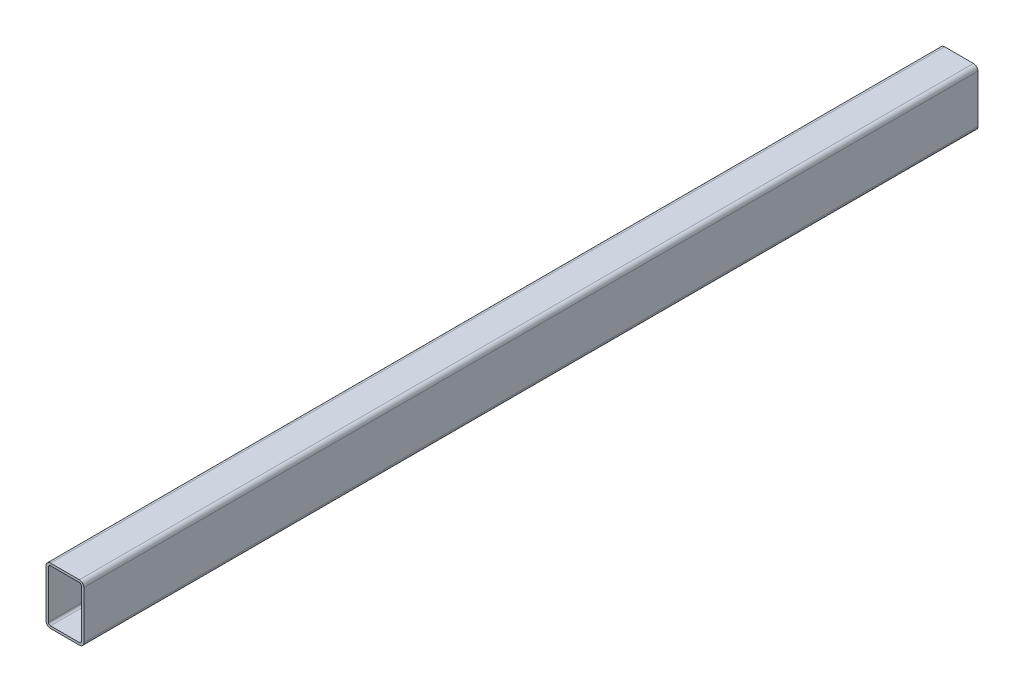
ISO-10303-21;
HEADER;
FILE_DESCRIPTION(('STEP AP214'),'2;1');
FILE_NAME('part.step','',(''),(''),'','','');
FILE_SCHEMA(('AUTOMOTIVE_DESIGN { 1 0 10303 214 1 1 1 1 }'));
ENDSEC;
DATA;
#1=APPLICATION_CONTEXT('core data for automotive mechanical design processes');
#2=APPLICATION_PROTOCOL_DEFINITION('international standard','automotive_design',2000,#1);
#3=PRODUCT_CONTEXT('',#1,'mechanical');
#4=PRODUCT('Part','Part','',(#3));
#5=PRODUCT_RELATED_PRODUCT_CATEGORY('part','',(#4));
#6=PRODUCT_DEFINITION_FORMATION('','',#4);
#7=PRODUCT_DEFINITION_CONTEXT('part definition',#1,'design');
#8=PRODUCT_DEFINITION('design','',#6,#7);
#9=PRODUCT_DEFINITION_SHAPE('','',#8);
#10=(LENGTH_UNIT() NAMED_UNIT(*) SI_UNIT(.MILLI.,.METRE.));
#11=(NAMED_UNIT(*) PLANE_ANGLE_UNIT() SI_UNIT($,.RADIAN.));
#12=(NAMED_UNIT(*) SI_UNIT($,.STERADIAN.) SOLID_ANGLE_UNIT());
#13=UNCERTAINTY_MEASURE_WITH_UNIT(LENGTH_MEASURE(1.E-05),#10,'distance_accuracy_value','');
#14=(GEOMETRIC_REPRESENTATION_CONTEXT(3) GLOBAL_UNCERTAINTY_ASSIGNED_CONTEXT((#13)) GLOBAL_UNIT_ASSIGNED_CONTEXT((#10,
#11,#12)) REPRESENTATION_CONTEXT('',''));
#15=CARTESIAN_POINT('',(0.,0.,0.));
#16=DIRECTION('',(0.,0.,1.));
#17=DIRECTION('',(1.,0.,0.));
#18=AXIS2_PLACEMENT_3D('',#15,#16,#17);
#19=CARTESIAN_POINT('',(-19.4,-32.1,600.8));
#20=DIRECTION('',(0.,0.,-1.));
#21=DIRECTION('',(-1.,0.,0.));
#22=AXIS2_PLACEMENT_3D('',#19,#20,#21);
#23=PLANE('',#22);
#24=CARTESIAN_POINT('',(-19.4,-32.1,600.8));
#25=DIRECTION('',(0.,0.,1.));
#26=DIRECTION('',(-1.,0.,0.));
#27=AXIS2_PLACEMENT_3D('',#24,#25,#26);
#28=CIRCLE('',#27,5.99999999999999);
#29=CARTESIAN_POINT('',(-25.4,-32.1,600.8));
#30=VERTEX_POINT('',#29);
#31=CARTESIAN_POINT('',(-19.4,-38.1,600.8));
#32=VERTEX_POINT('',#31);
#33=EDGE_CURVE('E215',#30,#32,#28,.T.);
#34=ORIENTED_EDGE('',*,*,#33,.T.);
#35=DIRECTION('',(1.,0.,0.));
#36=VECTOR('',#35,1.);
#37=CARTESIAN_POINT('',(19.4,-38.1,600.8));
#38=LINE('',#37,#36);
#39=CARTESIAN_POINT('',(19.4,-38.1,600.8));
#40=VERTEX_POINT('',#39);
#41=EDGE_CURVE('E218',#32,#40,#38,.T.);
#42=ORIENTED_EDGE('',*,*,#41,.T.);
#43=CARTESIAN_POINT('',(19.4,-32.1,600.8));
#44=DIRECTION('',(0.,0.,1.));
#45=DIRECTION('',(1.,0.,0.));
#46=AXIS2_PLACEMENT_3D('',#43,#44,#45);
#47=CIRCLE('',#46,6.);
#48=CARTESIAN_POINT('',(25.4,-32.1,600.8));
#49=VERTEX_POINT('',#48);
#50=EDGE_CURVE('E221',#40,#49,#47,.T.);
#51=ORIENTED_EDGE('',*,*,#50,.T.);
#52=DIRECTION('',(0.,1.,0.));
#53=VECTOR('',#52,1.);
#54=CARTESIAN_POINT('',(25.4,-32.1,600.8));
#55=LINE('',#54,#53);
#56=CARTESIAN_POINT('',(25.4,32.1,600.8));
#57=VERTEX_POINT('',#56);
#58=EDGE_CURVE('E223',#49,#57,#55,.T.);
#59=ORIENTED_EDGE('',*,*,#58,.T.);
#60=CARTESIAN_POINT('',(19.4,32.1,600.8));
#61=DIRECTION('',(0.,0.,1.));
#62=DIRECTION('',(1.,0.,0.));
#63=AXIS2_PLACEMENT_3D('',#60,#61,#62);
#64=CIRCLE('',#63,6.);
#65=CARTESIAN_POINT('',(19.4,38.1,600.8));
#66=VERTEX_POINT('',#65);
#67=EDGE_CURVE('E225',#57,#66,#64,.T.);
#68=ORIENTED_EDGE('',*,*,#67,.T.);
#69=DIRECTION('',(-1.,0.,0.));
#70=VECTOR('',#69,1.);
#71=CARTESIAN_POINT('',(19.4,38.1,600.8));
#72=LINE('',#71,#70);
#73=CARTESIAN_POINT('',(-19.4,38.1,600.8));
#74=VERTEX_POINT('',#73);
#75=EDGE_CURVE('E227',#66,#74,#72,.T.);
#76=ORIENTED_EDGE('',*,*,#75,.T.);
#77=CARTESIAN_POINT('',(-19.4,32.1,600.8));
#78=DIRECTION('',(0.,0.,1.));
#79=DIRECTION('',(1.,0.,0.));
#80=AXIS2_PLACEMENT_3D('',#77,#78,#79);
#81=CIRCLE('',#80,6.);
#82=CARTESIAN_POINT('',(-25.4,32.1,600.8));
#83=VERTEX_POINT('',#82);
#84=EDGE_CURVE('E229',#74,#83,#81,.T.);
#85=ORIENTED_EDGE('',*,*,#84,.T.);
#86=DIRECTION('',(0.,-1.,0.));
#87=VECTOR('',#86,1.);
#88=CARTESIAN_POINT('',(-25.4,-32.1,600.8));
#89=LINE('',#88,#87);
#90=EDGE_CURVE('E231',#83,#30,#89,.T.);
#91=ORIENTED_EDGE('',*,*,#90,.T.);
#92=EDGE_LOOP('',(#34,#42,#51,#59,#68,#76,#85,#91));
#93=FACE_BOUND('',#92,.T.);
#94=CARTESIAN_POINT('',(19.4,32.1,600.8));
#95=DIRECTION('',(0.,0.,1.));
#96=DIRECTION('',(1.,0.,0.));
#97=AXIS2_PLACEMENT_3D('',#94,#95,#96);
#98=CIRCLE('',#97,2.825);
#99=CARTESIAN_POINT('',(22.225,32.1,600.8));
#100=VERTEX_POINT('',#99);
#101=CARTESIAN_POINT('',(19.4,34.925,600.8));
#102=VERTEX_POINT('',#101);
#103=EDGE_CURVE('E150',#100,#102,#98,.T.);
#104=ORIENTED_EDGE('',*,*,#103,.F.);
#105=DIRECTION('',(0.,1.,0.));
#106=VECTOR('',#105,1.);
#107=CARTESIAN_POINT('',(22.225,-32.1,600.8));
#108=LINE('',#107,#106);
#109=CARTESIAN_POINT('',(22.225,-32.1,600.8));
#110=VERTEX_POINT('',#109);
#111=EDGE_CURVE('E183',#110,#100,#108,.T.);
#112=ORIENTED_EDGE('',*,*,#111,.F.);
#113=CARTESIAN_POINT('',(19.4,-32.1,600.8));
#114=DIRECTION('',(0.,0.,1.));
#115=DIRECTION('',(1.,0.,0.));
#116=AXIS2_PLACEMENT_3D('',#113,#114,#115);
#117=CIRCLE('',#116,2.825);
#118=CARTESIAN_POINT('',(19.4,-34.925,600.8));
#119=VERTEX_POINT('',#118);
#120=EDGE_CURVE('E181',#119,#110,#117,.T.);
#121=ORIENTED_EDGE('',*,*,#120,.F.);
#122=DIRECTION('',(1.,0.,0.));
#123=VECTOR('',#122,1.);
#124=CARTESIAN_POINT('',(19.4,-34.925,600.8));
#125=LINE('',#124,#123);
#126=CARTESIAN_POINT('',(-19.4,-34.925,600.8));
#127=VERTEX_POINT('',#126);
#128=EDGE_CURVE('E179',#127,#119,#125,.T.);
#129=ORIENTED_EDGE('',*,*,#128,.F.);
#130=CARTESIAN_POINT('',(-19.4,-32.1,600.8));
#131=DIRECTION('',(0.,0.,1.));
#132=DIRECTION('',(-1.,0.,0.));
#133=AXIS2_PLACEMENT_3D('',#130,#131,#132);
#134=CIRCLE('',#133,2.825);
#135=CARTESIAN_POINT('',(-22.225,-32.1,600.8));
#136=VERTEX_POINT('',#135);
#137=EDGE_CURVE('E177',#136,#127,#134,.T.);
#138=ORIENTED_EDGE('',*,*,#137,.F.);
#139=DIRECTION('',(0.,-1.,0.));
#140=VECTOR('',#139,1.);
#141=CARTESIAN_POINT('',(-22.225,-32.1,600.8));
#142=LINE('',#141,#140);
#143=CARTESIAN_POINT('',(-22.225,32.1,600.8));
#144=VERTEX_POINT('',#143);
#145=EDGE_CURVE('E173',#144,#136,#142,.T.);
#146=ORIENTED_EDGE('',*,*,#145,.F.);
#147=CARTESIAN_POINT('',(-19.4,32.1,600.8));
#148=DIRECTION('',(0.,0.,1.));
#149=DIRECTION('',(1.,0.,0.));
#150=AXIS2_PLACEMENT_3D('',#147,#148,#149);
#151=CIRCLE('',#150,2.825);
#152=CARTESIAN_POINT('',(-19.4,34.925,600.8));
#153=VERTEX_POINT('',#152);
#154=EDGE_CURVE('E171',#153,#144,#151,.T.);
#155=ORIENTED_EDGE('',*,*,#154,.F.);
#156=DIRECTION('',(-1.,0.,0.));
#157=VECTOR('',#156,1.);
#158=CARTESIAN_POINT('',(19.4,34.925,600.8));
#159=LINE('',#158,#157);
#160=EDGE_CURVE('E158',#102,#153,#159,.T.);
#161=ORIENTED_EDGE('',*,*,#160,.F.);
#162=EDGE_LOOP('',(#104,#112,#121,#129,#138,#146,#155,#161));
#163=FACE_BOUND('',#162,.T.);
#164=ADVANCED_FACE('F37',(#93,#163),#23,.F.);
#165=CARTESIAN_POINT('',(-19.4,-32.1,-600.8));
#166=DIRECTION('',(0.,0.,-1.));
#167=DIRECTION('',(-1.,0.,0.));
#168=AXIS2_PLACEMENT_3D('',#165,#166,#167);
#169=PLANE('',#168);
#170=CARTESIAN_POINT('',(-19.4,-32.1,-600.8));
#171=DIRECTION('',(0.,0.,1.));
#172=DIRECTION('',(-1.,0.,0.));
#173=AXIS2_PLACEMENT_3D('',#170,#171,#172);
#174=CIRCLE('',#173,5.99999999999999);
#175=CARTESIAN_POINT('',(-25.4,-32.1,-600.8));
#176=VERTEX_POINT('',#175);
#177=CARTESIAN_POINT('',(-19.4,-38.1,-600.8));
#178=VERTEX_POINT('',#177);
#179=EDGE_CURVE('E166',#176,#178,#174,.T.);
#180=ORIENTED_EDGE('',*,*,#179,.F.);
#181=DIRECTION('',(0.,-1.,0.));
#182=VECTOR('',#181,1.);
#183=CARTESIAN_POINT('',(-25.4,-32.1,-600.8));
#184=LINE('',#183,#182);
#185=CARTESIAN_POINT('',(-25.4,32.1,-600.8));
#186=VERTEX_POINT('',#185);
#187=EDGE_CURVE('E219',#186,#176,#184,.T.);
#188=ORIENTED_EDGE('',*,*,#187,.F.);
#189=CARTESIAN_POINT('',(-19.4,32.1,-600.8));
#190=DIRECTION('',(0.,0.,1.));
#191=DIRECTION('',(1.,0.,0.));
#192=AXIS2_PLACEMENT_3D('',#189,#190,#191);
#193=CIRCLE('',#192,6.);
#194=CARTESIAN_POINT('',(-19.4,38.1,-600.8));
#195=VERTEX_POINT('',#194);
#196=EDGE_CURVE('E246',#195,#186,#193,.T.);
#197=ORIENTED_EDGE('',*,*,#196,.F.);
#198=DIRECTION('',(-1.,0.,0.));
#199=VECTOR('',#198,1.);
#200=CARTESIAN_POINT('',(19.4,38.1,-600.8));
#201=LINE('',#200,#199);
#202=CARTESIAN_POINT('',(19.4,38.1,-600.8));
#203=VERTEX_POINT('',#202);
#204=EDGE_CURVE('E244',#203,#195,#201,.T.);
#205=ORIENTED_EDGE('',*,*,#204,.F.);
#206=CARTESIAN_POINT('',(19.4,32.1,-600.8));
#207=DIRECTION('',(0.,0.,1.));
#208=DIRECTION('',(1.,0.,0.));
#209=AXIS2_PLACEMENT_3D('',#206,#207,#208);
#210=CIRCLE('',#209,6.);
#211=CARTESIAN_POINT('',(25.4,32.1,-600.8));
#212=VERTEX_POINT('',#211);
#213=EDGE_CURVE('E242',#212,#203,#210,.T.);
#214=ORIENTED_EDGE('',*,*,#213,.F.);
#215=DIRECTION('',(0.,1.,0.));
#216=VECTOR('',#215,1.);
#217=CARTESIAN_POINT('',(25.4,-32.1,-600.8));
#218=LINE('',#217,#216);
#219=CARTESIAN_POINT('',(25.4,-32.1,-600.8));
#220=VERTEX_POINT('',#219);
#221=EDGE_CURVE('E240',#220,#212,#218,.T.);
#222=ORIENTED_EDGE('',*,*,#221,.F.);
#223=CARTESIAN_POINT('',(19.4,-32.1,-600.8));
#224=DIRECTION('',(0.,0.,1.));
#225=DIRECTION('',(1.,0.,0.));
#226=AXIS2_PLACEMENT_3D('',#223,#224,#225);
#227=CIRCLE('',#226,6.);
#228=CARTESIAN_POINT('',(19.4,-38.1,-600.8));
#229=VERTEX_POINT('',#228);
#230=EDGE_CURVE('E238',#229,#220,#227,.T.);
#231=ORIENTED_EDGE('',*,*,#230,.F.);
#232=DIRECTION('',(1.,0.,0.));
#233=VECTOR('',#232,1.);
#234=CARTESIAN_POINT('',(19.4,-38.1,-600.8));
#235=LINE('',#234,#233);
#236=EDGE_CURVE('E236',#178,#229,#235,.T.);
#237=ORIENTED_EDGE('',*,*,#236,.F.);
#238=EDGE_LOOP('',(#180,#188,#197,#205,#214,#222,#231,#237));
#239=FACE_BOUND('',#238,.T.);
#240=DIRECTION('',(0.,1.,0.));
#241=VECTOR('',#240,1.);
#242=CARTESIAN_POINT('',(22.225,-32.1,-600.8));
#243=LINE('',#242,#241);
#244=CARTESIAN_POINT('',(22.225,-32.1,-600.8));
#245=VERTEX_POINT('',#244);
#246=CARTESIAN_POINT('',(22.225,32.1,-600.8));
#247=VERTEX_POINT('',#246);
#248=EDGE_CURVE('E159',#245,#247,#243,.T.);
#249=ORIENTED_EDGE('',*,*,#248,.T.);
#250=CARTESIAN_POINT('',(19.4,32.1,-600.8));
#251=DIRECTION('',(0.,0.,1.));
#252=DIRECTION('',(1.,0.,0.));
#253=AXIS2_PLACEMENT_3D('',#250,#251,#252);
#254=CIRCLE('',#253,2.825);
#255=CARTESIAN_POINT('',(19.4,34.925,-600.8));
#256=VERTEX_POINT('',#255);
#257=EDGE_CURVE('E60',#247,#256,#254,.T.);
#258=ORIENTED_EDGE('',*,*,#257,.T.);
#259=DIRECTION('',(-1.,0.,0.));
#260=VECTOR('',#259,1.);
#261=CARTESIAN_POINT('',(19.4,34.925,-600.8));
#262=LINE('',#261,#260);
#263=CARTESIAN_POINT('',(-19.4,34.925,-600.8));
#264=VERTEX_POINT('',#263);
#265=EDGE_CURVE('E165',#256,#264,#262,.T.);
#266=ORIENTED_EDGE('',*,*,#265,.T.);
#267=CARTESIAN_POINT('',(-19.4,32.1,-600.8));
#268=DIRECTION('',(0.,0.,1.));
#269=DIRECTION('',(1.,0.,0.));
#270=AXIS2_PLACEMENT_3D('',#267,#268,#269);
#271=CIRCLE('',#270,2.825);
#272=CARTESIAN_POINT('',(-22.225,32.1,-600.8));
#273=VERTEX_POINT('',#272);
#274=EDGE_CURVE('E187',#264,#273,#271,.T.);
#275=ORIENTED_EDGE('',*,*,#274,.T.);
#276=DIRECTION('',(0.,-1.,0.));
#277=VECTOR('',#276,1.);
#278=CARTESIAN_POINT('',(-22.225,-32.1,-600.8));
#279=LINE('',#278,#277);
#280=CARTESIAN_POINT('',(-22.225,-32.1,-600.8));
#281=VERTEX_POINT('',#280);
#282=EDGE_CURVE('E190',#273,#281,#279,.T.);
#283=ORIENTED_EDGE('',*,*,#282,.T.);
#284=CARTESIAN_POINT('',(-19.4,-32.1,-600.8));
#285=DIRECTION('',(0.,0.,1.));
#286=DIRECTION('',(-1.,0.,0.));
#287=AXIS2_PLACEMENT_3D('',#284,#285,#286);
#288=CIRCLE('',#287,2.825);
#289=CARTESIAN_POINT('',(-19.4,-34.925,-600.8));
#290=VERTEX_POINT('',#289);
#291=EDGE_CURVE('E193',#281,#290,#288,.T.);
#292=ORIENTED_EDGE('',*,*,#291,.T.);
#293=DIRECTION('',(1.,0.,0.));
#294=VECTOR('',#293,1.);
#295=CARTESIAN_POINT('',(19.4,-34.925,-600.8));
#296=LINE('',#295,#294);
#297=CARTESIAN_POINT('',(19.4,-34.925,-600.8));
#298=VERTEX_POINT('',#297);
#299=EDGE_CURVE('E196',#290,#298,#296,.T.);
#300=ORIENTED_EDGE('',*,*,#299,.T.);
#301=CARTESIAN_POINT('',(19.4,-32.1,-600.8));
#302=DIRECTION('',(0.,0.,1.));
#303=DIRECTION('',(1.,0.,0.));
#304=AXIS2_PLACEMENT_3D('',#301,#302,#303);
#305=CIRCLE('',#304,2.825);
#306=EDGE_CURVE('E199',#298,#245,#305,.T.);
#307=ORIENTED_EDGE('',*,*,#306,.T.);
#308=EDGE_LOOP('',(#249,#258,#266,#275,#283,#292,#300,#307));
#309=FACE_BOUND('',#308,.T.);
#310=ADVANCED_FACE('F276',(#239,#309),#169,.T.);
#311=CARTESIAN_POINT('',(-19.4,-32.1,600.8));
#312=DIRECTION('',(0.,0.,-1.));
#313=DIRECTION('',(-1.,0.,0.));
#314=AXIS2_PLACEMENT_3D('',#311,#312,#313);
#315=CYLINDRICAL_SURFACE('',#314,5.99999999999999);
#316=ORIENTED_EDGE('',*,*,#179,.T.);
#317=DIRECTION('',(0.,0.,-1.));
#318=VECTOR('',#317,1.);
#319=CARTESIAN_POINT('',(-19.4,-38.1,600.8));
#320=LINE('',#319,#318);
#321=EDGE_CURVE('E11',#32,#178,#320,.T.);
#322=ORIENTED_EDGE('',*,*,#321,.F.);
#323=ORIENTED_EDGE('',*,*,#33,.F.);
#324=DIRECTION('',(0.,0.,-1.));
#325=VECTOR('',#324,1.);
#326=CARTESIAN_POINT('',(-25.4,-32.1,600.8));
#327=LINE('',#326,#325);
#328=EDGE_CURVE('E233',#30,#176,#327,.T.);
#329=ORIENTED_EDGE('',*,*,#328,.T.);
#330=EDGE_LOOP('',(#316,#322,#323,#329));
#331=FACE_BOUND('',#330,.T.);
#332=ADVANCED_FACE('F39',(#331),#315,.T.);
#333=CARTESIAN_POINT('',(19.4,-38.1,600.8));
#334=DIRECTION('',(0.,1.,0.));
#335=DIRECTION('',(-1.,0.,0.));
#336=AXIS2_PLACEMENT_3D('',#333,#334,#335);
#337=PLANE('',#336);
#338=ORIENTED_EDGE('',*,*,#236,.T.);
#339=DIRECTION('',(0.,0.,-1.));
#340=VECTOR('',#339,1.);
#341=CARTESIAN_POINT('',(19.4,-38.1,600.8));
#342=LINE('',#341,#340);
#343=EDGE_CURVE('E45',#40,#229,#342,.T.);
#344=ORIENTED_EDGE('',*,*,#343,.F.);
#345=ORIENTED_EDGE('',*,*,#41,.F.);
#346=ORIENTED_EDGE('',*,*,#321,.T.);
#347=EDGE_LOOP('',(#338,#344,#345,#346));
#348=FACE_BOUND('',#347,.T.);
#349=ADVANCED_FACE('F293',(#348),#337,.F.);
#350=CARTESIAN_POINT('',(19.4,-32.1,600.8));
#351=DIRECTION('',(0.,0.,-1.));
#352=DIRECTION('',(-1.,0.,0.));
#353=AXIS2_PLACEMENT_3D('',#350,#351,#352);
#354=CYLINDRICAL_SURFACE('',#353,6.);
#355=ORIENTED_EDGE('',*,*,#230,.T.);
#356=DIRECTION('',(0.,0.,-1.));
#357=VECTOR('',#356,1.);
#358=CARTESIAN_POINT('',(25.4,-32.1,600.8));
#359=LINE('',#358,#357);
#360=EDGE_CURVE('E263',#49,#220,#359,.T.);
#361=ORIENTED_EDGE('',*,*,#360,.F.);
#362=ORIENTED_EDGE('',*,*,#50,.F.);
#363=ORIENTED_EDGE('',*,*,#343,.T.);
#364=EDGE_LOOP('',(#355,#361,#362,#363));
#365=FACE_BOUND('',#364,.T.);
#366=ADVANCED_FACE('F270',(#365),#354,.T.);
#367=CARTESIAN_POINT('',(25.4,-32.1,600.8));
#368=DIRECTION('',(-1.,0.,0.));
#369=DIRECTION('',(0.,0.,1.));
#370=AXIS2_PLACEMENT_3D('',#367,#368,#369);
#371=PLANE('',#370);
#372=ORIENTED_EDGE('',*,*,#221,.T.);
#373=DIRECTION('',(0.,0.,-1.));
#374=VECTOR('',#373,1.);
#375=CARTESIAN_POINT('',(25.4,32.1,600.8));
#376=LINE('',#375,#374);
#377=EDGE_CURVE('E260',#57,#212,#376,.T.);
#378=ORIENTED_EDGE('',*,*,#377,.F.);
#379=ORIENTED_EDGE('',*,*,#58,.F.);
#380=ORIENTED_EDGE('',*,*,#360,.T.);
#381=EDGE_LOOP('',(#372,#378,#379,#380));
#382=FACE_BOUND('',#381,.T.);
#383=ADVANCED_FACE('F282',(#382),#371,.F.);
#384=CARTESIAN_POINT('',(19.4,32.1,600.8));
#385=DIRECTION('',(0.,0.,-1.));
#386=DIRECTION('',(-1.,0.,0.));
#387=AXIS2_PLACEMENT_3D('',#384,#385,#386);
#388=CYLINDRICAL_SURFACE('',#387,6.);
#389=ORIENTED_EDGE('',*,*,#213,.T.);
#390=DIRECTION('',(0.,0.,-1.));
#391=VECTOR('',#390,1.);
#392=CARTESIAN_POINT('',(19.4,38.1,600.8));
#393=LINE('',#392,#391);
#394=EDGE_CURVE('E257',#66,#203,#393,.T.);
#395=ORIENTED_EDGE('',*,*,#394,.F.);
#396=ORIENTED_EDGE('',*,*,#67,.F.);
#397=ORIENTED_EDGE('',*,*,#377,.T.);
#398=EDGE_LOOP('',(#389,#395,#396,#397));
#399=FACE_BOUND('',#398,.T.);
#400=ADVANCED_FACE('F286',(#399),#388,.T.);
#401=CARTESIAN_POINT('',(19.4,38.1,600.8));
#402=DIRECTION('',(0.,-1.,0.));
#403=DIRECTION('',(1.,0.,0.));
#404=AXIS2_PLACEMENT_3D('',#401,#402,#403);
#405=PLANE('',#404);
#406=ORIENTED_EDGE('',*,*,#204,.T.);
#407=DIRECTION('',(0.,0.,-1.));
#408=VECTOR('',#407,1.);
#409=CARTESIAN_POINT('',(-19.4,38.1,600.8));
#410=LINE('',#409,#408);
#411=EDGE_CURVE('E254',#74,#195,#410,.T.);
#412=ORIENTED_EDGE('',*,*,#411,.F.);
#413=ORIENTED_EDGE('',*,*,#75,.F.);
#414=ORIENTED_EDGE('',*,*,#394,.T.);
#415=EDGE_LOOP('',(#406,#412,#413,#414));
#416=FACE_BOUND('',#415,.T.);
#417=ADVANCED_FACE('F306',(#416),#405,.F.);
#418=CARTESIAN_POINT('',(-19.4,32.1,600.8));
#419=DIRECTION('',(0.,0.,-1.));
#420=DIRECTION('',(-1.,0.,0.));
#421=AXIS2_PLACEMENT_3D('',#418,#419,#420);
#422=CYLINDRICAL_SURFACE('',#421,6.);
#423=ORIENTED_EDGE('',*,*,#196,.T.);
#424=DIRECTION('',(0.,0.,-1.));
#425=VECTOR('',#424,1.);
#426=CARTESIAN_POINT('',(-25.4,32.1,600.8));
#427=LINE('',#426,#425);
#428=EDGE_CURVE('E251',#83,#186,#427,.T.);
#429=ORIENTED_EDGE('',*,*,#428,.F.);
#430=ORIENTED_EDGE('',*,*,#84,.F.);
#431=ORIENTED_EDGE('',*,*,#411,.T.);
#432=EDGE_LOOP('',(#423,#429,#430,#431));
#433=FACE_BOUND('',#432,.T.);
#434=ADVANCED_FACE('F304',(#433),#422,.T.);
#435=CARTESIAN_POINT('',(-25.4,-32.1,600.8));
#436=DIRECTION('',(1.,0.,0.));
#437=DIRECTION('',(0.,1.,0.));
#438=AXIS2_PLACEMENT_3D('',#435,#436,#437);
#439=PLANE('',#438);
#440=ORIENTED_EDGE('',*,*,#187,.T.);
#441=ORIENTED_EDGE('',*,*,#328,.F.);
#442=ORIENTED_EDGE('',*,*,#90,.F.);
#443=ORIENTED_EDGE('',*,*,#428,.T.);
#444=EDGE_LOOP('',(#440,#441,#442,#443));
#445=FACE_BOUND('',#444,.T.);
#446=ADVANCED_FACE('F299',(#445),#439,.F.);
#447=CARTESIAN_POINT('',(19.4,32.1,600.8));
#448=DIRECTION('',(0.,0.,-1.));
#449=DIRECTION('',(-1.,0.,0.));
#450=AXIS2_PLACEMENT_3D('',#447,#448,#449);
#451=CYLINDRICAL_SURFACE('',#450,2.825);
#452=ORIENTED_EDGE('',*,*,#257,.F.);
#453=DIRECTION('',(0.,0.,-1.));
#454=VECTOR('',#453,1.);
#455=CARTESIAN_POINT('',(22.225,32.1,600.8));
#456=LINE('',#455,#454);
#457=EDGE_CURVE('E154',#100,#247,#456,.T.);
#458=ORIENTED_EDGE('',*,*,#457,.F.);
#459=ORIENTED_EDGE('',*,*,#103,.T.);
#460=DIRECTION('',(0.,0.,-1.));
#461=VECTOR('',#460,1.);
#462=CARTESIAN_POINT('',(19.4,34.925,600.8));
#463=LINE('',#462,#461);
#464=EDGE_CURVE('E153',#102,#256,#463,.T.);
#465=ORIENTED_EDGE('',*,*,#464,.T.);
#466=EDGE_LOOP('',(#452,#458,#459,#465));
#467=FACE_BOUND('',#466,.T.);
#468=ADVANCED_FACE('F152',(#467),#451,.F.);
#469=CARTESIAN_POINT('',(19.4,34.925,600.8));
#470=DIRECTION('',(0.,-1.,0.));
#471=DIRECTION('',(1.,0.,0.));
#472=AXIS2_PLACEMENT_3D('',#469,#470,#471);
#473=PLANE('',#472);
#474=ORIENTED_EDGE('',*,*,#265,.F.);
#475=ORIENTED_EDGE('',*,*,#464,.F.);
#476=ORIENTED_EDGE('',*,*,#160,.T.);
#477=DIRECTION('',(0.,0.,-1.));
#478=VECTOR('',#477,1.);
#479=CARTESIAN_POINT('',(-19.4,34.925,600.8));
#480=LINE('',#479,#478);
#481=EDGE_CURVE('E167',#153,#264,#480,.T.);
#482=ORIENTED_EDGE('',*,*,#481,.T.);
#483=EDGE_LOOP('',(#474,#475,#476,#482));
#484=FACE_BOUND('',#483,.T.);
#485=ADVANCED_FACE('F162',(#484),#473,.T.);
#486=CARTESIAN_POINT('',(-19.4,32.1,600.8));
#487=DIRECTION('',(0.,0.,-1.));
#488=DIRECTION('',(-1.,0.,0.));
#489=AXIS2_PLACEMENT_3D('',#486,#487,#488);
#490=CYLINDRICAL_SURFACE('',#489,2.825);
#491=ORIENTED_EDGE('',*,*,#274,.F.);
#492=ORIENTED_EDGE('',*,*,#481,.F.);
#493=ORIENTED_EDGE('',*,*,#154,.T.);
#494=DIRECTION('',(0.,0.,-1.));
#495=VECTOR('',#494,1.);
#496=CARTESIAN_POINT('',(-22.225,32.1,600.8));
#497=LINE('',#496,#495);
#498=EDGE_CURVE('E212',#144,#273,#497,.T.);
#499=ORIENTED_EDGE('',*,*,#498,.T.);
#500=EDGE_LOOP('',(#491,#492,#493,#499));
#501=FACE_BOUND('',#500,.T.);
#502=ADVANCED_FACE('F331',(#501),#490,.F.);
#503=CARTESIAN_POINT('',(-22.225,-32.1,600.8));
#504=DIRECTION('',(1.,0.,0.));
#505=DIRECTION('',(0.,1.,0.));
#506=AXIS2_PLACEMENT_3D('',#503,#504,#505);
#507=PLANE('',#506);
#508=ORIENTED_EDGE('',*,*,#282,.F.);
#509=ORIENTED_EDGE('',*,*,#498,.F.);
#510=ORIENTED_EDGE('',*,*,#145,.T.);
#511=DIRECTION('',(0.,0.,-1.));
#512=VECTOR('',#511,1.);
#513=CARTESIAN_POINT('',(-22.225,-32.1,600.8));
#514=LINE('',#513,#512);
#515=EDGE_CURVE('E210',#136,#281,#514,.T.);
#516=ORIENTED_EDGE('',*,*,#515,.T.);
#517=EDGE_LOOP('',(#508,#509,#510,#516));
#518=FACE_BOUND('',#517,.T.);
#519=ADVANCED_FACE('F335',(#518),#507,.T.);
#520=CARTESIAN_POINT('',(-19.4,-32.1,600.8));
#521=DIRECTION('',(0.,0.,-1.));
#522=DIRECTION('',(-1.,0.,0.));
#523=AXIS2_PLACEMENT_3D('',#520,#521,#522);
#524=CYLINDRICAL_SURFACE('',#523,2.825);
#525=ORIENTED_EDGE('',*,*,#291,.F.);
#526=ORIENTED_EDGE('',*,*,#515,.F.);
#527=ORIENTED_EDGE('',*,*,#137,.T.);
#528=DIRECTION('',(0.,0.,-1.));
#529=VECTOR('',#528,1.);
#530=CARTESIAN_POINT('',(-19.4,-34.925,600.8));
#531=LINE('',#530,#529);
#532=EDGE_CURVE('E208',#127,#290,#531,.T.);
#533=ORIENTED_EDGE('',*,*,#532,.T.);
#534=EDGE_LOOP('',(#525,#526,#527,#533));
#535=FACE_BOUND('',#534,.T.);
#536=ADVANCED_FACE('F341',(#535),#524,.F.);
#537=CARTESIAN_POINT('',(19.4,-34.925,600.8));
#538=DIRECTION('',(0.,1.,0.));
#539=DIRECTION('',(-1.,0.,0.));
#540=AXIS2_PLACEMENT_3D('',#537,#538,#539);
#541=PLANE('',#540);
#542=ORIENTED_EDGE('',*,*,#299,.F.);
#543=ORIENTED_EDGE('',*,*,#532,.F.);
#544=ORIENTED_EDGE('',*,*,#128,.T.);
#545=DIRECTION('',(0.,0.,-1.));
#546=VECTOR('',#545,1.);
#547=CARTESIAN_POINT('',(19.4,-34.925,600.8));
#548=LINE('',#547,#546);
#549=EDGE_CURVE('E206',#119,#298,#548,.T.);
#550=ORIENTED_EDGE('',*,*,#549,.T.);
#551=EDGE_LOOP('',(#542,#543,#544,#550));
#552=FACE_BOUND('',#551,.T.);
#553=ADVANCED_FACE('F345',(#552),#541,.T.);
#554=CARTESIAN_POINT('',(19.4,-32.1,600.8));
#555=DIRECTION('',(0.,0.,-1.));
#556=DIRECTION('',(-1.,0.,0.));
#557=AXIS2_PLACEMENT_3D('',#554,#555,#556);
#558=CYLINDRICAL_SURFACE('',#557,2.825);
#559=ORIENTED_EDGE('',*,*,#306,.F.);
#560=ORIENTED_EDGE('',*,*,#549,.F.);
#561=ORIENTED_EDGE('',*,*,#120,.T.);
#562=DIRECTION('',(0.,0.,-1.));
#563=VECTOR('',#562,1.);
#564=CARTESIAN_POINT('',(22.225,-32.1,600.8));
#565=LINE('',#564,#563);
#566=EDGE_CURVE('E52',#110,#245,#565,.T.);
#567=ORIENTED_EDGE('',*,*,#566,.T.);
#568=EDGE_LOOP('',(#559,#560,#561,#567));
#569=FACE_BOUND('',#568,.T.);
#570=ADVANCED_FACE('F349',(#569),#558,.F.);
#571=CARTESIAN_POINT('',(22.225,-32.1,600.8));
#572=DIRECTION('',(-1.,0.,0.));
#573=DIRECTION('',(0.,0.,1.));
#574=AXIS2_PLACEMENT_3D('',#571,#572,#573);
#575=PLANE('',#574);
#576=ORIENTED_EDGE('',*,*,#248,.F.);
#577=ORIENTED_EDGE('',*,*,#566,.F.);
#578=ORIENTED_EDGE('',*,*,#111,.T.);
#579=ORIENTED_EDGE('',*,*,#457,.T.);
#580=EDGE_LOOP('',(#576,#577,#578,#579));
#581=FACE_BOUND('',#580,.T.);
#582=ADVANCED_FACE('F353',(#581),#575,.T.);
#583=CLOSED_SHELL('',(#164,#310,#332,#349,#366,#383,#400,#417,#434,#446,#468,#485,#502,#519,
#536,#553,#570,#582));
#584=MANIFOLD_SOLID_BREP('B2',#583);
#585=ADVANCED_BREP_SHAPE_REPRESENTATION('',(#18,#584),#14);
#586=SHAPE_DEFINITION_REPRESENTATION(#9,#585);
ENDSEC;
END-ISO-10303-21;
